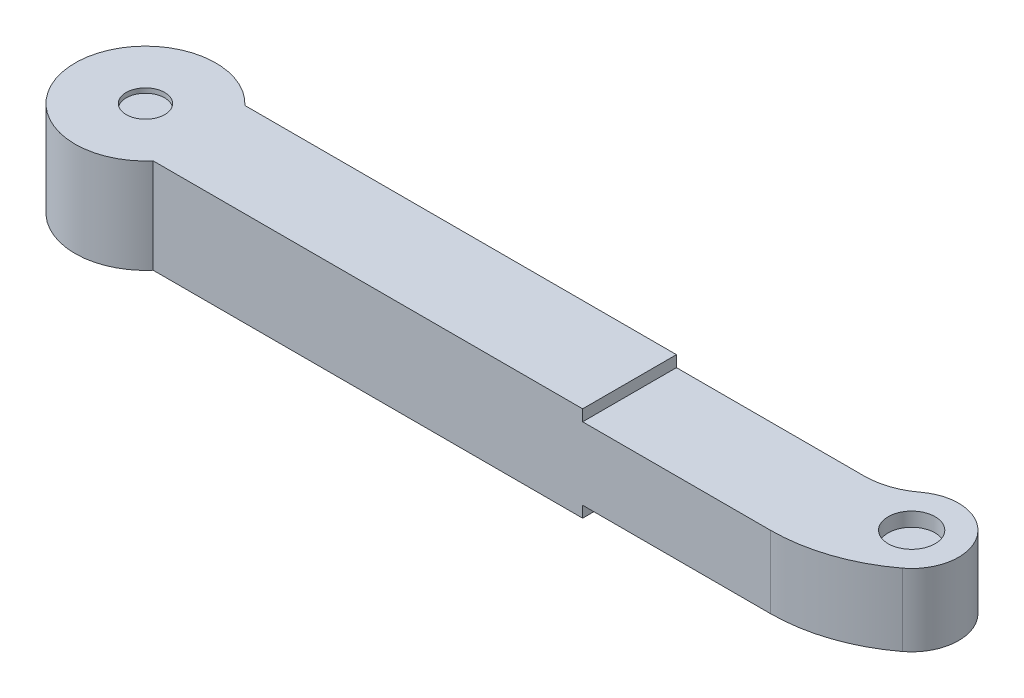
ISO-10303-21;
HEADER;
FILE_DESCRIPTION(('STEP AP214'),'2;1');
FILE_NAME('part.step','',(''),(''),'','','');
FILE_SCHEMA(('AUTOMOTIVE_DESIGN { 1 0 10303 214 1 1 1 1 }'));
ENDSEC;
DATA;
#1=APPLICATION_CONTEXT('core data for automotive mechanical design processes');
#2=APPLICATION_PROTOCOL_DEFINITION('international standard','automotive_design',2000,#1);
#3=PRODUCT_CONTEXT('',#1,'mechanical');
#4=PRODUCT('Part','Part','',(#3));
#5=PRODUCT_RELATED_PRODUCT_CATEGORY('part','',(#4));
#6=PRODUCT_DEFINITION_FORMATION('','',#4);
#7=PRODUCT_DEFINITION_CONTEXT('part definition',#1,'design');
#8=PRODUCT_DEFINITION('design','',#6,#7);
#9=PRODUCT_DEFINITION_SHAPE('','',#8);
#10=(LENGTH_UNIT() NAMED_UNIT(*) SI_UNIT(.MILLI.,.METRE.));
#11=(NAMED_UNIT(*) PLANE_ANGLE_UNIT() SI_UNIT($,.RADIAN.));
#12=(NAMED_UNIT(*) SI_UNIT($,.STERADIAN.) SOLID_ANGLE_UNIT());
#13=UNCERTAINTY_MEASURE_WITH_UNIT(LENGTH_MEASURE(1.E-05),#10,'distance_accuracy_value','');
#14=(GEOMETRIC_REPRESENTATION_CONTEXT(3) GLOBAL_UNCERTAINTY_ASSIGNED_CONTEXT((#13)) GLOBAL_UNIT_ASSIGNED_CONTEXT((#10,
#11,#12)) REPRESENTATION_CONTEXT('',''));
#15=CARTESIAN_POINT('',(0.,0.,0.));
#16=DIRECTION('',(0.,0.,1.));
#17=DIRECTION('',(1.,0.,0.));
#18=AXIS2_PLACEMENT_3D('',#15,#16,#17);
#19=CARTESIAN_POINT('',(-33.0550843311361,10.1,-5.0083461107782));
#20=DIRECTION('',(0.,0.,1.));
#21=DIRECTION('',(1.,0.,0.));
#22=AXIS2_PLACEMENT_3D('',#19,#20,#21);
#23=PLANE('',#22);
#24=DIRECTION('',(-1.,0.,0.));
#25=VECTOR('',#24,1.);
#26=CARTESIAN_POINT('',(-33.0550843311361,10.1,-5.0083461107782));
#27=LINE('',#26,#25);
#28=CARTESIAN_POINT('',(12.9449156688639,10.1,-5.0083461107782));
#29=VERTEX_POINT('',#28);
#30=CARTESIAN_POINT('',(-33.0550843311361,10.1,-5.0083461107782));
#31=VERTEX_POINT('',#30);
#32=EDGE_CURVE('E210',#29,#31,#27,.T.);
#33=ORIENTED_EDGE('',*,*,#32,.F.);
#34=DIRECTION('',(0.,-1.,0.));
#35=VECTOR('',#34,1.);
#36=CARTESIAN_POINT('',(12.9449156688639,10.1,-5.0083461107782));
#37=LINE('',#36,#35);
#38=CARTESIAN_POINT('',(12.9449156688639,8.9,-5.0083461107782));
#39=VERTEX_POINT('',#38);
#40=EDGE_CURVE('E59',#29,#39,#37,.T.);
#41=ORIENTED_EDGE('',*,*,#40,.T.);
#42=DIRECTION('',(1.,0.,0.));
#43=VECTOR('',#42,1.);
#44=CARTESIAN_POINT('',(-33.0550843311361,8.9,-5.0083461107782));
#45=LINE('',#44,#43);
#46=CARTESIAN_POINT('',(32.9449156688639,8.9,-5.0083461107782));
#47=VERTEX_POINT('',#46);
#48=EDGE_CURVE('E197',#39,#47,#45,.T.);
#49=ORIENTED_EDGE('',*,*,#48,.T.);
#50=DIRECTION('',(0.,-1.,0.));
#51=VECTOR('',#50,1.);
#52=CARTESIAN_POINT('',(32.9449156688639,10.1,-5.0083461107782));
#53=LINE('',#52,#51);
#54=CARTESIAN_POINT('',(32.9449156688639,1.2,-5.0083461107782));
#55=VERTEX_POINT('',#54);
#56=EDGE_CURVE('E239',#47,#55,#53,.T.);
#57=ORIENTED_EDGE('',*,*,#56,.T.);
#58=DIRECTION('',(-1.,0.,0.));
#59=VECTOR('',#58,1.);
#60=CARTESIAN_POINT('',(-33.0550843311361,1.2,-5.0083461107782));
#61=LINE('',#60,#59);
#62=CARTESIAN_POINT('',(12.9449156688639,1.2,-5.0083461107782));
#63=VERTEX_POINT('',#62);
#64=EDGE_CURVE('E193',#55,#63,#61,.T.);
#65=ORIENTED_EDGE('',*,*,#64,.T.);
#66=DIRECTION('',(0.,-1.,0.));
#67=VECTOR('',#66,1.);
#68=CARTESIAN_POINT('',(12.9449156688639,10.1,-5.0083461107782));
#69=LINE('',#68,#67);
#70=CARTESIAN_POINT('',(12.9449156688639,0.,-5.0083461107782));
#71=VERTEX_POINT('',#70);
#72=EDGE_CURVE('E180',#63,#71,#69,.T.);
#73=ORIENTED_EDGE('',*,*,#72,.T.);
#74=DIRECTION('',(-1.,0.,0.));
#75=VECTOR('',#74,1.);
#76=CARTESIAN_POINT('',(-33.0550843311361,0.,-5.0083461107782));
#77=LINE('',#76,#75);
#78=CARTESIAN_POINT('',(-33.0550843311361,0.,-5.0083461107782));
#79=VERTEX_POINT('',#78);
#80=EDGE_CURVE('E206',#71,#79,#77,.T.);
#81=ORIENTED_EDGE('',*,*,#80,.T.);
#82=DIRECTION('',(0.,-1.,0.));
#83=VECTOR('',#82,1.);
#84=CARTESIAN_POINT('',(-33.0550843311361,10.1,-5.0083461107782));
#85=LINE('',#84,#83);
#86=EDGE_CURVE('E235',#31,#79,#85,.T.);
#87=ORIENTED_EDGE('',*,*,#86,.F.);
#88=EDGE_LOOP('',(#33,#41,#49,#57,#65,#73,#81,#87));
#89=FACE_BOUND('',#88,.T.);
#90=ADVANCED_FACE('F45',(#89),#23,.F.);
#91=CARTESIAN_POINT('',(-38.5328354325306,10.1,0.11456740314836));
#92=DIRECTION('',(0.,-1.,0.));
#93=DIRECTION('',(0.,0.,-1.));
#94=AXIS2_PLACEMENT_3D('',#91,#92,#93);
#95=CYLINDRICAL_SURFACE('',#94,7.5);
#96=CARTESIAN_POINT('',(-38.5328354325306,0.,0.11456740314836));
#97=DIRECTION('',(0.,1.,0.));
#98=DIRECTION('',(0.,0.,1.));
#99=AXIS2_PLACEMENT_3D('',#96,#97,#98);
#100=CIRCLE('',#99,7.5);
#101=CARTESIAN_POINT('',(-32.835114185632,0.,4.9916538892218));
#102=VERTEX_POINT('',#101);
#103=EDGE_CURVE('E223',#79,#102,#100,.T.);
#104=ORIENTED_EDGE('',*,*,#103,.T.);
#105=DIRECTION('',(0.,-1.,0.));
#106=VECTOR('',#105,1.);
#107=CARTESIAN_POINT('',(-32.835114185632,10.1,4.9916538892218));
#108=LINE('',#107,#106);
#109=CARTESIAN_POINT('',(-32.835114185632,10.1,4.9916538892218));
#110=VERTEX_POINT('',#109);
#111=EDGE_CURVE('E231',#110,#102,#108,.T.);
#112=ORIENTED_EDGE('',*,*,#111,.F.);
#113=CARTESIAN_POINT('',(-38.5328354325306,10.1,0.11456740314836));
#114=DIRECTION('',(0.,1.,0.));
#115=DIRECTION('',(0.,0.,1.));
#116=AXIS2_PLACEMENT_3D('',#113,#114,#115);
#117=CIRCLE('',#116,7.5);
#118=EDGE_CURVE('E213',#31,#110,#117,.T.);
#119=ORIENTED_EDGE('',*,*,#118,.F.);
#120=ORIENTED_EDGE('',*,*,#86,.T.);
#121=EDGE_LOOP('',(#104,#112,#119,#120));
#122=FACE_BOUND('',#121,.T.);
#123=ADVANCED_FACE('F256',(#122),#95,.T.);
#124=CARTESIAN_POINT('',(-32.835114185632,10.1,4.9916538892218));
#125=DIRECTION('',(0.,0.,-1.));
#126=DIRECTION('',(-1.,0.,0.));
#127=AXIS2_PLACEMENT_3D('',#124,#125,#126);
#128=PLANE('',#127);
#129=DIRECTION('',(1.,0.,0.));
#130=VECTOR('',#129,1.);
#131=CARTESIAN_POINT('',(12.9449156688639,8.9,4.9916538892218));
#132=LINE('',#131,#130);
#133=CARTESIAN_POINT('',(12.9449156688639,8.9,4.9916538892218));
#134=VERTEX_POINT('',#133);
#135=CARTESIAN_POINT('',(32.9449156688638,8.9,4.9916538892218));
#136=VERTEX_POINT('',#135);
#137=EDGE_CURVE('E173',#134,#136,#132,.T.);
#138=ORIENTED_EDGE('',*,*,#137,.F.);
#139=DIRECTION('',(0.,-1.,0.));
#140=VECTOR('',#139,1.);
#141=CARTESIAN_POINT('',(12.9449156688639,10.1,4.9916538892218));
#142=LINE('',#141,#140);
#143=CARTESIAN_POINT('',(12.9449156688639,10.1,4.9916538892218));
#144=VERTEX_POINT('',#143);
#145=EDGE_CURVE('E169',#144,#134,#142,.T.);
#146=ORIENTED_EDGE('',*,*,#145,.F.);
#147=DIRECTION('',(1.,0.,0.));
#148=VECTOR('',#147,1.);
#149=CARTESIAN_POINT('',(-32.835114185632,10.1,4.9916538892218));
#150=LINE('',#149,#148);
#151=EDGE_CURVE('E217',#110,#144,#150,.T.);
#152=ORIENTED_EDGE('',*,*,#151,.F.);
#153=ORIENTED_EDGE('',*,*,#111,.T.);
#154=DIRECTION('',(1.,0.,0.));
#155=VECTOR('',#154,1.);
#156=CARTESIAN_POINT('',(-32.835114185632,0.,4.9916538892218));
#157=LINE('',#156,#155);
#158=CARTESIAN_POINT('',(12.9449156688639,0.,4.9916538892218));
#159=VERTEX_POINT('',#158);
#160=EDGE_CURVE('E214',#102,#159,#157,.T.);
#161=ORIENTED_EDGE('',*,*,#160,.T.);
#162=DIRECTION('',(0.,-1.,0.));
#163=VECTOR('',#162,1.);
#164=CARTESIAN_POINT('',(12.9449156688639,0.,4.9916538892218));
#165=LINE('',#164,#163);
#166=CARTESIAN_POINT('',(12.9449156688639,1.2,4.9916538892218));
#167=VERTEX_POINT('',#166);
#168=EDGE_CURVE('E67',#167,#159,#165,.T.);
#169=ORIENTED_EDGE('',*,*,#168,.F.);
#170=DIRECTION('',(-1.,0.,0.));
#171=VECTOR('',#170,1.);
#172=CARTESIAN_POINT('',(12.9449156688639,1.2,4.9916538892218));
#173=LINE('',#172,#171);
#174=CARTESIAN_POINT('',(32.9449156688639,1.2,4.9916538892218));
#175=VERTEX_POINT('',#174);
#176=EDGE_CURVE('E183',#175,#167,#173,.T.);
#177=ORIENTED_EDGE('',*,*,#176,.F.);
#178=DIRECTION('',(0.,-1.,0.));
#179=VECTOR('',#178,1.);
#180=CARTESIAN_POINT('',(32.9449156688639,10.1,4.9916538892218));
#181=LINE('',#180,#179);
#182=EDGE_CURVE('E146',#136,#175,#181,.T.);
#183=ORIENTED_EDGE('',*,*,#182,.F.);
#184=EDGE_LOOP('',(#138,#146,#152,#153,#161,#169,#177,#183));
#185=FACE_BOUND('',#184,.T.);
#186=ADVANCED_FACE('F250',(#185),#128,.F.);
#187=CARTESIAN_POINT('',(-38.5328354325306,10.1,0.11456740314836));
#188=DIRECTION('',(0.,1.,0.));
#189=DIRECTION('',(0.,0.,1.));
#190=AXIS2_PLACEMENT_3D('',#187,#188,#189);
#191=PLANE('',#190);
#192=DIRECTION('',(0.,0.,1.));
#193=VECTOR('',#192,1.);
#194=CARTESIAN_POINT('',(12.9449156688639,10.1,0.11456740314836));
#195=LINE('',#194,#193);
#196=EDGE_CURVE('E11',#29,#144,#195,.T.);
#197=ORIENTED_EDGE('',*,*,#196,.F.);
#198=ORIENTED_EDGE('',*,*,#32,.T.);
#199=ORIENTED_EDGE('',*,*,#118,.T.);
#200=ORIENTED_EDGE('',*,*,#151,.T.);
#201=EDGE_LOOP('',(#197,#198,#199,#200));
#202=FACE_BOUND('',#201,.T.);
#203=CARTESIAN_POINT('',(-38.5328354325306,10.1,0.11456740314836));
#204=DIRECTION('',(0.,1.,0.));
#205=DIRECTION('',(0.,0.,1.));
#206=AXIS2_PLACEMENT_3D('',#203,#204,#205);
#207=CIRCLE('',#206,2.05);
#208=CARTESIAN_POINT('',(-38.5328354325306,10.1,2.16456740314836));
#209=VERTEX_POINT('',#208);
#210=EDGE_CURVE('E201',#209,#209,#207,.T.);
#211=ORIENTED_EDGE('',*,*,#210,.F.);
#212=EDGE_LOOP('',(#211));
#213=FACE_BOUND('',#212,.T.);
#214=ADVANCED_FACE('F266',(#202,#213),#191,.T.);
#215=CARTESIAN_POINT('',(-38.5328354325306,0.,0.11456740314836));
#216=DIRECTION('',(0.,1.,0.));
#217=DIRECTION('',(0.,0.,1.));
#218=AXIS2_PLACEMENT_3D('',#215,#216,#217);
#219=PLANE('',#218);
#220=ORIENTED_EDGE('',*,*,#80,.F.);
#221=DIRECTION('',(0.,0.,1.));
#222=VECTOR('',#221,1.);
#223=CARTESIAN_POINT('',(12.9449156688639,0.,0.11456740314836));
#224=LINE('',#223,#222);
#225=EDGE_CURVE('E53',#71,#159,#224,.T.);
#226=ORIENTED_EDGE('',*,*,#225,.T.);
#227=ORIENTED_EDGE('',*,*,#160,.F.);
#228=ORIENTED_EDGE('',*,*,#103,.F.);
#229=EDGE_LOOP('',(#220,#226,#227,#228));
#230=FACE_BOUND('',#229,.T.);
#231=ADVANCED_FACE('F246',(#230),#219,.F.);
#232=CARTESIAN_POINT('',(-38.5328354325306,9.6,0.11456740314836));
#233=DIRECTION('',(0.,1.,0.));
#234=DIRECTION('',(0.,0.,1.));
#235=AXIS2_PLACEMENT_3D('',#232,#233,#234);
#236=CYLINDRICAL_SURFACE('',#235,2.05);
#237=CARTESIAN_POINT('',(-38.5328354325306,9.6,0.11456740314836));
#238=DIRECTION('',(0.,1.,0.));
#239=DIRECTION('',(0.,0.,1.));
#240=AXIS2_PLACEMENT_3D('',#237,#238,#239);
#241=CIRCLE('',#240,2.05);
#242=CARTESIAN_POINT('',(-38.5328354325306,9.6,2.16456740314836));
#243=VERTEX_POINT('',#242);
#244=EDGE_CURVE('E202',#243,#243,#241,.T.);
#245=ORIENTED_EDGE('',*,*,#244,.F.);
#246=EDGE_LOOP('',(#245));
#247=FACE_BOUND('',#246,.T.);
#248=ORIENTED_EDGE('',*,*,#210,.T.);
#249=EDGE_LOOP('',(#248));
#250=FACE_BOUND('',#249,.T.);
#251=ADVANCED_FACE('F272',(#247,#250),#236,.F.);
#252=CARTESIAN_POINT('',(-38.5328354325306,9.6,0.11456740314836));
#253=DIRECTION('',(0.,1.,0.));
#254=DIRECTION('',(0.,0.,1.));
#255=AXIS2_PLACEMENT_3D('',#252,#253,#254);
#256=PLANE('',#255);
#257=ORIENTED_EDGE('',*,*,#244,.T.);
#258=EDGE_LOOP('',(#257));
#259=FACE_BOUND('',#258,.T.);
#260=ADVANCED_FACE('F274',(#259),#256,.T.);
#261=CARTESIAN_POINT('',(12.9449156688639,1.2,-7.38543259685164));
#262=DIRECTION('',(0.,1.,0.));
#263=DIRECTION('',(0.,0.,1.));
#264=AXIS2_PLACEMENT_3D('',#261,#262,#263);
#265=PLANE('',#264);
#266=CARTESIAN_POINT('',(40.4851288582243,1.2,-2.53863272176874));
#267=DIRECTION('',(0.,1.,0.));
#268=DIRECTION('',(0.,0.,1.));
#269=AXIS2_PLACEMENT_3D('',#266,#267,#268);
#270=CIRCLE('',#269,2.5);
#271=CARTESIAN_POINT('',(40.4851288582243,1.2,-0.0386327217687388));
#272=VERTEX_POINT('',#271);
#273=EDGE_CURVE('E439',#272,#272,#270,.T.);
#274=ORIENTED_EDGE('',*,*,#273,.T.);
#275=EDGE_LOOP('',(#274));
#276=FACE_BOUND('',#275,.T.);
#277=ORIENTED_EDGE('',*,*,#64,.F.);
#278=CARTESIAN_POINT('',(32.9449156688639,1.2,-12.5083461107782));
#279=DIRECTION('',(0.,-1.,0.));
#280=DIRECTION('',(0.,0.,1.));
#281=AXIS2_PLACEMENT_3D('',#278,#279,#280);
#282=CIRCLE('',#281,7.5);
#283=CARTESIAN_POINT('',(37.4690435824801,1.2,-6.52651807737253));
#284=VERTEX_POINT('',#283);
#285=EDGE_CURVE('E133',#284,#55,#282,.T.);
#286=ORIENTED_EDGE('',*,*,#285,.F.);
#287=CARTESIAN_POINT('',(40.4851288582243,1.2,-2.53863272176874));
#288=DIRECTION('',(0.,1.,0.));
#289=DIRECTION('',(0.,0.,1.));
#290=AXIS2_PLACEMENT_3D('',#287,#288,#289);
#291=CIRCLE('',#290,5.);
#292=CARTESIAN_POINT('',(43.5012141339685,1.2,1.44925263383504));
#293=VERTEX_POINT('',#292);
#294=EDGE_CURVE('E125',#293,#284,#291,.T.);
#295=ORIENTED_EDGE('',*,*,#294,.F.);
#296=CARTESIAN_POINT('',(32.9449156688639,1.2,-12.5083461107782));
#297=DIRECTION('',(0.,1.,0.));
#298=DIRECTION('',(0.,0.,1.));
#299=AXIS2_PLACEMENT_3D('',#296,#297,#298);
#300=CIRCLE('',#299,17.5);
#301=EDGE_CURVE('E140',#175,#293,#300,.T.);
#302=ORIENTED_EDGE('',*,*,#301,.F.);
#303=ORIENTED_EDGE('',*,*,#176,.T.);
#304=DIRECTION('',(0.,0.,1.));
#305=VECTOR('',#304,1.);
#306=CARTESIAN_POINT('',(12.9449156688639,1.2,-7.38543259685164));
#307=LINE('',#306,#305);
#308=EDGE_CURVE('E167',#63,#167,#307,.T.);
#309=ORIENTED_EDGE('',*,*,#308,.F.);
#310=EDGE_LOOP('',(#277,#286,#295,#302,#303,#309));
#311=FACE_BOUND('',#310,.T.);
#312=ADVANCED_FACE('F138',(#276,#311),#265,.F.);
#313=CARTESIAN_POINT('',(12.9449156688639,0.,-7.38543259685164));
#314=DIRECTION('',(-1.,0.,0.));
#315=DIRECTION('',(0.,0.,1.));
#316=AXIS2_PLACEMENT_3D('',#313,#314,#315);
#317=PLANE('',#316);
#318=ORIENTED_EDGE('',*,*,#308,.T.);
#319=ORIENTED_EDGE('',*,*,#168,.T.);
#320=ORIENTED_EDGE('',*,*,#225,.F.);
#321=ORIENTED_EDGE('',*,*,#72,.F.);
#322=EDGE_LOOP('',(#318,#319,#320,#321));
#323=FACE_BOUND('',#322,.T.);
#324=ADVANCED_FACE('F261',(#323),#317,.F.);
#325=CARTESIAN_POINT('',(12.9449156688639,8.9,-7.38543259685164));
#326=DIRECTION('',(0.,-1.,0.));
#327=DIRECTION('',(1.,0.,0.));
#328=AXIS2_PLACEMENT_3D('',#325,#326,#327);
#329=PLANE('',#328);
#330=CARTESIAN_POINT('',(40.4851288582243,8.9,-2.53863272176874));
#331=DIRECTION('',(0.,1.,0.));
#332=DIRECTION('',(0.,0.,1.));
#333=AXIS2_PLACEMENT_3D('',#330,#331,#332);
#334=CIRCLE('',#333,2.5);
#335=CARTESIAN_POINT('',(40.4851288582243,8.9,-0.0386327217687388));
#336=VERTEX_POINT('',#335);
#337=EDGE_CURVE('E155',#336,#336,#334,.T.);
#338=ORIENTED_EDGE('',*,*,#337,.F.);
#339=EDGE_LOOP('',(#338));
#340=FACE_BOUND('',#339,.T.);
#341=DIRECTION('',(0.,0.,1.));
#342=VECTOR('',#341,1.);
#343=CARTESIAN_POINT('',(12.9449156688639,8.9,-7.38543259685164));
#344=LINE('',#343,#342);
#345=EDGE_CURVE('E177',#39,#134,#344,.T.);
#346=ORIENTED_EDGE('',*,*,#345,.T.);
#347=ORIENTED_EDGE('',*,*,#137,.T.);
#348=CARTESIAN_POINT('',(32.9449156688639,8.9,-12.5083461107782));
#349=DIRECTION('',(0.,1.,0.));
#350=DIRECTION('',(0.,0.,1.));
#351=AXIS2_PLACEMENT_3D('',#348,#349,#350);
#352=CIRCLE('',#351,17.5);
#353=CARTESIAN_POINT('',(43.5012141339685,8.9,1.44925263383504));
#354=VERTEX_POINT('',#353);
#355=EDGE_CURVE('E160',#136,#354,#352,.T.);
#356=ORIENTED_EDGE('',*,*,#355,.T.);
#357=CARTESIAN_POINT('',(40.4851288582243,8.9,-2.53863272176874));
#358=DIRECTION('',(0.,1.,0.));
#359=DIRECTION('',(0.,0.,1.));
#360=AXIS2_PLACEMENT_3D('',#357,#358,#359);
#361=CIRCLE('',#360,5.);
#362=CARTESIAN_POINT('',(37.4690435824801,8.9,-6.52651807737253));
#363=VERTEX_POINT('',#362);
#364=EDGE_CURVE('E127',#354,#363,#361,.T.);
#365=ORIENTED_EDGE('',*,*,#364,.T.);
#366=CARTESIAN_POINT('',(32.9449156688639,8.9,-12.5083461107782));
#367=DIRECTION('',(0.,-1.,0.));
#368=DIRECTION('',(0.,0.,1.));
#369=AXIS2_PLACEMENT_3D('',#366,#367,#368);
#370=CIRCLE('',#369,7.5);
#371=EDGE_CURVE('E149',#363,#47,#370,.T.);
#372=ORIENTED_EDGE('',*,*,#371,.T.);
#373=ORIENTED_EDGE('',*,*,#48,.F.);
#374=EDGE_LOOP('',(#346,#347,#356,#365,#372,#373));
#375=FACE_BOUND('',#374,.T.);
#376=ADVANCED_FACE('F263',(#340,#375),#329,.F.);
#377=CARTESIAN_POINT('',(12.9449156688639,10.1,-7.38543259685164));
#378=DIRECTION('',(-1.,0.,0.));
#379=DIRECTION('',(0.,0.,1.));
#380=AXIS2_PLACEMENT_3D('',#377,#378,#379);
#381=PLANE('',#380);
#382=ORIENTED_EDGE('',*,*,#196,.T.);
#383=ORIENTED_EDGE('',*,*,#145,.T.);
#384=ORIENTED_EDGE('',*,*,#345,.F.);
#385=ORIENTED_EDGE('',*,*,#40,.F.);
#386=EDGE_LOOP('',(#382,#383,#384,#385));
#387=FACE_BOUND('',#386,.T.);
#388=ADVANCED_FACE('F264',(#387),#381,.F.);
#389=CARTESIAN_POINT('',(32.9449156688639,1.2,-12.5083461107782));
#390=DIRECTION('',(0.,1.,0.));
#391=DIRECTION('',(0.,0.,1.));
#392=AXIS2_PLACEMENT_3D('',#389,#390,#391);
#393=CYLINDRICAL_SURFACE('',#392,17.5);
#394=ORIENTED_EDGE('',*,*,#355,.F.);
#395=ORIENTED_EDGE('',*,*,#182,.T.);
#396=ORIENTED_EDGE('',*,*,#301,.T.);
#397=DIRECTION('',(0.,1.,0.));
#398=VECTOR('',#397,1.);
#399=CARTESIAN_POINT('',(43.5012141339685,1.2,1.44925263383504));
#400=LINE('',#399,#398);
#401=EDGE_CURVE('E122',#293,#354,#400,.T.);
#402=ORIENTED_EDGE('',*,*,#401,.T.);
#403=EDGE_LOOP('',(#394,#395,#396,#402));
#404=FACE_BOUND('',#403,.T.);
#405=ADVANCED_FACE('F144',(#404),#393,.T.);
#406=CARTESIAN_POINT('',(32.9449156688639,1.2,-12.5083461107782));
#407=DIRECTION('',(0.,1.,0.));
#408=DIRECTION('',(0.,0.,1.));
#409=AXIS2_PLACEMENT_3D('',#406,#407,#408);
#410=CYLINDRICAL_SURFACE('',#409,7.5);
#411=ORIENTED_EDGE('',*,*,#371,.F.);
#412=DIRECTION('',(0.,1.,0.));
#413=VECTOR('',#412,1.);
#414=CARTESIAN_POINT('',(37.4690435824801,1.2,-6.52651807737253));
#415=LINE('',#414,#413);
#416=EDGE_CURVE('E132',#284,#363,#415,.T.);
#417=ORIENTED_EDGE('',*,*,#416,.F.);
#418=ORIENTED_EDGE('',*,*,#285,.T.);
#419=ORIENTED_EDGE('',*,*,#56,.F.);
#420=EDGE_LOOP('',(#411,#417,#418,#419));
#421=FACE_BOUND('',#420,.T.);
#422=ADVANCED_FACE('F304',(#421),#410,.F.);
#423=CARTESIAN_POINT('',(40.4851288582243,1.2,-2.53863272176874));
#424=DIRECTION('',(0.,1.,0.));
#425=DIRECTION('',(0.,0.,1.));
#426=AXIS2_PLACEMENT_3D('',#423,#424,#425);
#427=CYLINDRICAL_SURFACE('',#426,5.);
#428=ORIENTED_EDGE('',*,*,#364,.F.);
#429=ORIENTED_EDGE('',*,*,#401,.F.);
#430=ORIENTED_EDGE('',*,*,#294,.T.);
#431=ORIENTED_EDGE('',*,*,#416,.T.);
#432=EDGE_LOOP('',(#428,#429,#430,#431));
#433=FACE_BOUND('',#432,.T.);
#434=ADVANCED_FACE('F124',(#433),#427,.T.);
#435=CARTESIAN_POINT('',(40.4851288582243,7.4,-2.53863272176874));
#436=DIRECTION('',(0.,1.,0.));
#437=DIRECTION('',(0.,0.,1.));
#438=AXIS2_PLACEMENT_3D('',#435,#436,#437);
#439=CYLINDRICAL_SURFACE('',#438,2.5);
#440=CARTESIAN_POINT('',(40.4851288582243,7.4,-2.53863272176874));
#441=DIRECTION('',(0.,1.,0.));
#442=DIRECTION('',(0.,0.,1.));
#443=AXIS2_PLACEMENT_3D('',#440,#441,#442);
#444=CIRCLE('',#443,2.5);
#445=CARTESIAN_POINT('',(40.4851288582243,7.4,-0.0386327217687388));
#446=VERTEX_POINT('',#445);
#447=EDGE_CURVE('E163',#446,#446,#444,.T.);
#448=ORIENTED_EDGE('',*,*,#447,.F.);
#449=EDGE_LOOP('',(#448));
#450=FACE_BOUND('',#449,.T.);
#451=ORIENTED_EDGE('',*,*,#337,.T.);
#452=EDGE_LOOP('',(#451));
#453=FACE_BOUND('',#452,.T.);
#454=ADVANCED_FACE('F321',(#450,#453),#439,.F.);
#455=CARTESIAN_POINT('',(40.4851288582243,7.4,-2.53863272176874));
#456=DIRECTION('',(0.,1.,0.));
#457=DIRECTION('',(0.,0.,1.));
#458=AXIS2_PLACEMENT_3D('',#455,#456,#457);
#459=PLANE('',#458);
#460=ORIENTED_EDGE('',*,*,#447,.T.);
#461=EDGE_LOOP('',(#460));
#462=FACE_BOUND('',#461,.T.);
#463=ADVANCED_FACE('F337',(#462),#459,.T.);
#464=CARTESIAN_POINT('',(40.4851288582243,2.7,-2.53863272176874));
#465=DIRECTION('',(0.,-1.,0.));
#466=DIRECTION('',(0.,0.,-1.));
#467=AXIS2_PLACEMENT_3D('',#464,#465,#466);
#468=CYLINDRICAL_SURFACE('',#467,2.5);
#469=CARTESIAN_POINT('',(40.4851288582243,2.7,-2.53863272176874));
#470=DIRECTION('',(0.,1.,0.));
#471=DIRECTION('',(0.,0.,1.));
#472=AXIS2_PLACEMENT_3D('',#469,#470,#471);
#473=CIRCLE('',#472,2.5);
#474=CARTESIAN_POINT('',(40.4851288582243,2.7,-0.0386327217687388));
#475=VERTEX_POINT('',#474);
#476=EDGE_CURVE('E437',#475,#475,#473,.T.);
#477=ORIENTED_EDGE('',*,*,#476,.T.);
#478=EDGE_LOOP('',(#477));
#479=FACE_BOUND('',#478,.T.);
#480=ORIENTED_EDGE('',*,*,#273,.F.);
#481=EDGE_LOOP('',(#480));
#482=FACE_BOUND('',#481,.T.);
#483=ADVANCED_FACE('F346',(#479,#482),#468,.F.);
#484=CARTESIAN_POINT('',(40.4851288582243,2.7,-2.53863272176874));
#485=DIRECTION('',(0.,-1.,0.));
#486=DIRECTION('',(0.,0.,1.));
#487=AXIS2_PLACEMENT_3D('',#484,#485,#486);
#488=PLANE('',#487);
#489=ORIENTED_EDGE('',*,*,#476,.F.);
#490=EDGE_LOOP('',(#489));
#491=FACE_BOUND('',#490,.T.);
#492=ADVANCED_FACE('F363',(#491),#488,.T.);
#493=CLOSED_SHELL('',(#90,#123,#186,#214,#231,#251,#260,#312,#324,#376,#388,#405,#422,#434,#454,
#463,#483,#492));
#494=MANIFOLD_SOLID_BREP('B2',#493);
#495=ADVANCED_BREP_SHAPE_REPRESENTATION('',(#18,#494),#14);
#496=SHAPE_DEFINITION_REPRESENTATION(#9,#495);
ENDSEC;
END-ISO-10303-21;
